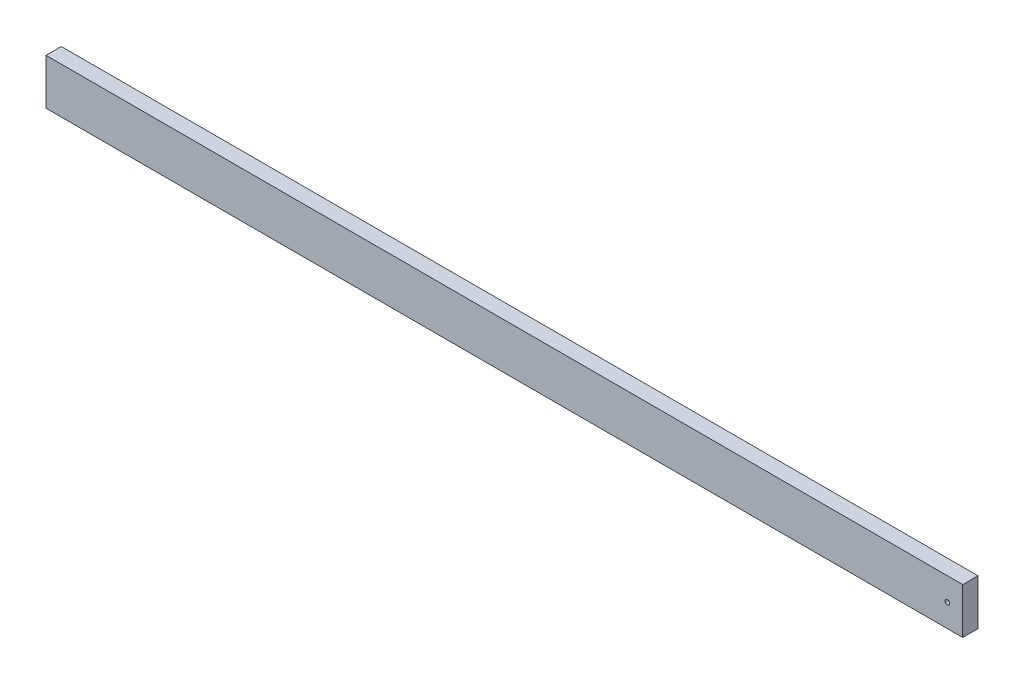
ISO-10303-21;
HEADER;
FILE_DESCRIPTION(('STEP AP214'),'2;1');
FILE_NAME('part.step','',(''),(''),'','','');
FILE_SCHEMA(('AUTOMOTIVE_DESIGN { 1 0 10303 214 1 1 1 1 }'));
ENDSEC;
DATA;
#1=APPLICATION_CONTEXT('core data for automotive mechanical design processes');
#2=APPLICATION_PROTOCOL_DEFINITION('international standard','automotive_design',2000,#1);
#3=PRODUCT_CONTEXT('',#1,'mechanical');
#4=PRODUCT('Part','Part','',(#3));
#5=PRODUCT_RELATED_PRODUCT_CATEGORY('part','',(#4));
#6=PRODUCT_DEFINITION_FORMATION('','',#4);
#7=PRODUCT_DEFINITION_CONTEXT('part definition',#1,'design');
#8=PRODUCT_DEFINITION('design','',#6,#7);
#9=PRODUCT_DEFINITION_SHAPE('','',#8);
#10=(LENGTH_UNIT() NAMED_UNIT(*) SI_UNIT(.MILLI.,.METRE.));
#11=(NAMED_UNIT(*) PLANE_ANGLE_UNIT() SI_UNIT($,.RADIAN.));
#12=(NAMED_UNIT(*) SI_UNIT($,.STERADIAN.) SOLID_ANGLE_UNIT());
#13=UNCERTAINTY_MEASURE_WITH_UNIT(LENGTH_MEASURE(1.E-05),#10,'distance_accuracy_value','');
#14=(GEOMETRIC_REPRESENTATION_CONTEXT(3) GLOBAL_UNCERTAINTY_ASSIGNED_CONTEXT((#13)) GLOBAL_UNIT_ASSIGNED_CONTEXT((#10,
#11,#12)) REPRESENTATION_CONTEXT('',''));
#15=CARTESIAN_POINT('',(0.,0.,0.));
#16=DIRECTION('',(0.,0.,1.));
#17=DIRECTION('',(1.,0.,0.));
#18=AXIS2_PLACEMENT_3D('',#15,#16,#17);
#19=CARTESIAN_POINT('',(0.,0.,10.));
#20=DIRECTION('',(0.,0.,1.));
#21=DIRECTION('',(1.,0.,0.));
#22=AXIS2_PLACEMENT_3D('',#19,#20,#21);
#23=PLANE('',#22);
#24=DIRECTION('',(1.,0.,0.));
#25=VECTOR('',#24,1.);
#26=CARTESIAN_POINT('',(-300.,-15.,10.));
#27=LINE('',#26,#25);
#28=CARTESIAN_POINT('',(-300.,-15.,10.));
#29=VERTEX_POINT('',#28);
#30=CARTESIAN_POINT('',(300.,-15.,10.));
#31=VERTEX_POINT('',#30);
#32=EDGE_CURVE('E92',#29,#31,#27,.T.);
#33=ORIENTED_EDGE('',*,*,#32,.T.);
#34=DIRECTION('',(0.,1.,0.));
#35=VECTOR('',#34,1.);
#36=CARTESIAN_POINT('',(300.,-15.,10.));
#37=LINE('',#36,#35);
#38=CARTESIAN_POINT('',(300.,15.,10.));
#39=VERTEX_POINT('',#38);
#40=EDGE_CURVE('E87',#31,#39,#37,.T.);
#41=ORIENTED_EDGE('',*,*,#40,.T.);
#42=DIRECTION('',(-1.,0.,0.));
#43=VECTOR('',#42,1.);
#44=CARTESIAN_POINT('',(-300.,15.,10.));
#45=LINE('',#44,#43);
#46=CARTESIAN_POINT('',(-300.,15.,10.));
#47=VERTEX_POINT('',#46);
#48=EDGE_CURVE('E90',#39,#47,#45,.T.);
#49=ORIENTED_EDGE('',*,*,#48,.T.);
#50=DIRECTION('',(0.,-1.,0.));
#51=VECTOR('',#50,1.);
#52=CARTESIAN_POINT('',(-300.,-15.,10.));
#53=LINE('',#52,#51);
#54=EDGE_CURVE('E57',#47,#29,#53,.T.);
#55=ORIENTED_EDGE('',*,*,#54,.T.);
#56=EDGE_LOOP('',(#33,#41,#49,#55));
#57=FACE_BOUND('',#56,.T.);
#58=CARTESIAN_POINT('',(290.,0.,10.));
#59=DIRECTION('',(0.,0.,1.));
#60=DIRECTION('',(1.,0.,0.));
#61=AXIS2_PLACEMENT_3D('',#58,#59,#60);
#62=CIRCLE('',#61,1.50000000000002);
#63=CARTESIAN_POINT('',(291.5,0.,10.));
#64=VERTEX_POINT('',#63);
#65=EDGE_CURVE('E112',#64,#64,#62,.T.);
#66=ORIENTED_EDGE('',*,*,#65,.F.);
#67=EDGE_LOOP('',(#66));
#68=FACE_BOUND('',#67,.T.);
#69=ADVANCED_FACE('F39',(#57,#68),#23,.T.);
#70=CARTESIAN_POINT('',(0.,0.,0.));
#71=DIRECTION('',(0.,0.,1.));
#72=DIRECTION('',(1.,0.,0.));
#73=AXIS2_PLACEMENT_3D('',#70,#71,#72);
#74=PLANE('',#73);
#75=DIRECTION('',(1.,0.,0.));
#76=VECTOR('',#75,1.);
#77=CARTESIAN_POINT('',(-300.,-15.,0.));
#78=LINE('',#77,#76);
#79=CARTESIAN_POINT('',(-300.,-15.,0.));
#80=VERTEX_POINT('',#79);
#81=CARTESIAN_POINT('',(300.,-15.,0.));
#82=VERTEX_POINT('',#81);
#83=EDGE_CURVE('E108',#80,#82,#78,.T.);
#84=ORIENTED_EDGE('',*,*,#83,.F.);
#85=DIRECTION('',(0.,-1.,0.));
#86=VECTOR('',#85,1.);
#87=CARTESIAN_POINT('',(-300.,-15.,0.));
#88=LINE('',#87,#86);
#89=CARTESIAN_POINT('',(-300.,15.,0.));
#90=VERTEX_POINT('',#89);
#91=EDGE_CURVE('E80',#90,#80,#88,.T.);
#92=ORIENTED_EDGE('',*,*,#91,.F.);
#93=DIRECTION('',(-1.,0.,0.));
#94=VECTOR('',#93,1.);
#95=CARTESIAN_POINT('',(-300.,15.,0.));
#96=LINE('',#95,#94);
#97=CARTESIAN_POINT('',(300.,15.,0.));
#98=VERTEX_POINT('',#97);
#99=EDGE_CURVE('E74',#98,#90,#96,.T.);
#100=ORIENTED_EDGE('',*,*,#99,.F.);
#101=DIRECTION('',(0.,1.,0.));
#102=VECTOR('',#101,1.);
#103=CARTESIAN_POINT('',(300.,-15.,0.));
#104=LINE('',#103,#102);
#105=EDGE_CURVE('E97',#82,#98,#104,.T.);
#106=ORIENTED_EDGE('',*,*,#105,.F.);
#107=EDGE_LOOP('',(#84,#92,#100,#106));
#108=FACE_BOUND('',#107,.T.);
#109=CARTESIAN_POINT('',(290.,0.,0.));
#110=DIRECTION('',(0.,0.,1.));
#111=DIRECTION('',(1.,0.,0.));
#112=AXIS2_PLACEMENT_3D('',#109,#110,#111);
#113=CIRCLE('',#112,1.50000000000002);
#114=CARTESIAN_POINT('',(291.5,0.,0.));
#115=VERTEX_POINT('',#114);
#116=EDGE_CURVE('E130',#115,#115,#113,.T.);
#117=ORIENTED_EDGE('',*,*,#116,.T.);
#118=EDGE_LOOP('',(#117));
#119=FACE_BOUND('',#118,.T.);
#120=ADVANCED_FACE('F125',(#108,#119),#74,.F.);
#121=CARTESIAN_POINT('',(-300.,-15.,10.));
#122=DIRECTION('',(0.,1.,0.));
#123=DIRECTION('',(0.,0.,1.));
#124=AXIS2_PLACEMENT_3D('',#121,#122,#123);
#125=PLANE('',#124);
#126=ORIENTED_EDGE('',*,*,#83,.T.);
#127=DIRECTION('',(0.,0.,-1.));
#128=VECTOR('',#127,1.);
#129=CARTESIAN_POINT('',(300.,-15.,10.));
#130=LINE('',#129,#128);
#131=EDGE_CURVE('E11',#31,#82,#130,.T.);
#132=ORIENTED_EDGE('',*,*,#131,.F.);
#133=ORIENTED_EDGE('',*,*,#32,.F.);
#134=DIRECTION('',(0.,0.,-1.));
#135=VECTOR('',#134,1.);
#136=CARTESIAN_POINT('',(-300.,-15.,10.));
#137=LINE('',#136,#135);
#138=EDGE_CURVE('E104',#29,#80,#137,.T.);
#139=ORIENTED_EDGE('',*,*,#138,.T.);
#140=EDGE_LOOP('',(#126,#132,#133,#139));
#141=FACE_BOUND('',#140,.T.);
#142=ADVANCED_FACE('F41',(#141),#125,.F.);
#143=CARTESIAN_POINT('',(300.,-15.,10.));
#144=DIRECTION('',(-1.,0.,0.));
#145=DIRECTION('',(0.,0.,1.));
#146=AXIS2_PLACEMENT_3D('',#143,#144,#145);
#147=PLANE('',#146);
#148=ORIENTED_EDGE('',*,*,#105,.T.);
#149=DIRECTION('',(0.,0.,-1.));
#150=VECTOR('',#149,1.);
#151=CARTESIAN_POINT('',(300.,15.,10.));
#152=LINE('',#151,#150);
#153=EDGE_CURVE('E49',#39,#98,#152,.T.);
#154=ORIENTED_EDGE('',*,*,#153,.F.);
#155=ORIENTED_EDGE('',*,*,#40,.F.);
#156=ORIENTED_EDGE('',*,*,#131,.T.);
#157=EDGE_LOOP('',(#148,#154,#155,#156));
#158=FACE_BOUND('',#157,.T.);
#159=ADVANCED_FACE('F96',(#158),#147,.F.);
#160=CARTESIAN_POINT('',(-300.,15.,10.));
#161=DIRECTION('',(0.,-1.,0.));
#162=DIRECTION('',(0.,0.,-1.));
#163=AXIS2_PLACEMENT_3D('',#160,#161,#162);
#164=PLANE('',#163);
#165=ORIENTED_EDGE('',*,*,#99,.T.);
#166=DIRECTION('',(0.,0.,-1.));
#167=VECTOR('',#166,1.);
#168=CARTESIAN_POINT('',(-300.,15.,10.));
#169=LINE('',#168,#167);
#170=EDGE_CURVE('E99',#47,#90,#169,.T.);
#171=ORIENTED_EDGE('',*,*,#170,.F.);
#172=ORIENTED_EDGE('',*,*,#48,.F.);
#173=ORIENTED_EDGE('',*,*,#153,.T.);
#174=EDGE_LOOP('',(#165,#171,#172,#173));
#175=FACE_BOUND('',#174,.T.);
#176=ADVANCED_FACE('F100',(#175),#164,.F.);
#177=CARTESIAN_POINT('',(-300.,-15.,10.));
#178=DIRECTION('',(1.,0.,0.));
#179=DIRECTION('',(0.,0.,-1.));
#180=AXIS2_PLACEMENT_3D('',#177,#178,#179);
#181=PLANE('',#180);
#182=ORIENTED_EDGE('',*,*,#91,.T.);
#183=ORIENTED_EDGE('',*,*,#138,.F.);
#184=ORIENTED_EDGE('',*,*,#54,.F.);
#185=ORIENTED_EDGE('',*,*,#170,.T.);
#186=EDGE_LOOP('',(#182,#183,#184,#185));
#187=FACE_BOUND('',#186,.T.);
#188=ADVANCED_FACE('F122',(#187),#181,.F.);
#189=CARTESIAN_POINT('',(290.,0.,10.));
#190=DIRECTION('',(0.,0.,-1.));
#191=DIRECTION('',(-1.,0.,0.));
#192=AXIS2_PLACEMENT_3D('',#189,#190,#191);
#193=CYLINDRICAL_SURFACE('',#192,1.50000000000002);
#194=ORIENTED_EDGE('',*,*,#65,.T.);
#195=EDGE_LOOP('',(#194));
#196=FACE_BOUND('',#195,.T.);
#197=ORIENTED_EDGE('',*,*,#116,.F.);
#198=EDGE_LOOP('',(#197));
#199=FACE_BOUND('',#198,.T.);
#200=ADVANCED_FACE('F138',(#196,#199),#193,.F.);
#201=CLOSED_SHELL('',(#69,#120,#142,#159,#176,#188,#200));
#202=MANIFOLD_SOLID_BREP('B2',#201);
#203=ADVANCED_BREP_SHAPE_REPRESENTATION('',(#18,#202),#14);
#204=SHAPE_DEFINITION_REPRESENTATION(#9,#203);
ENDSEC;
END-ISO-10303-21;
